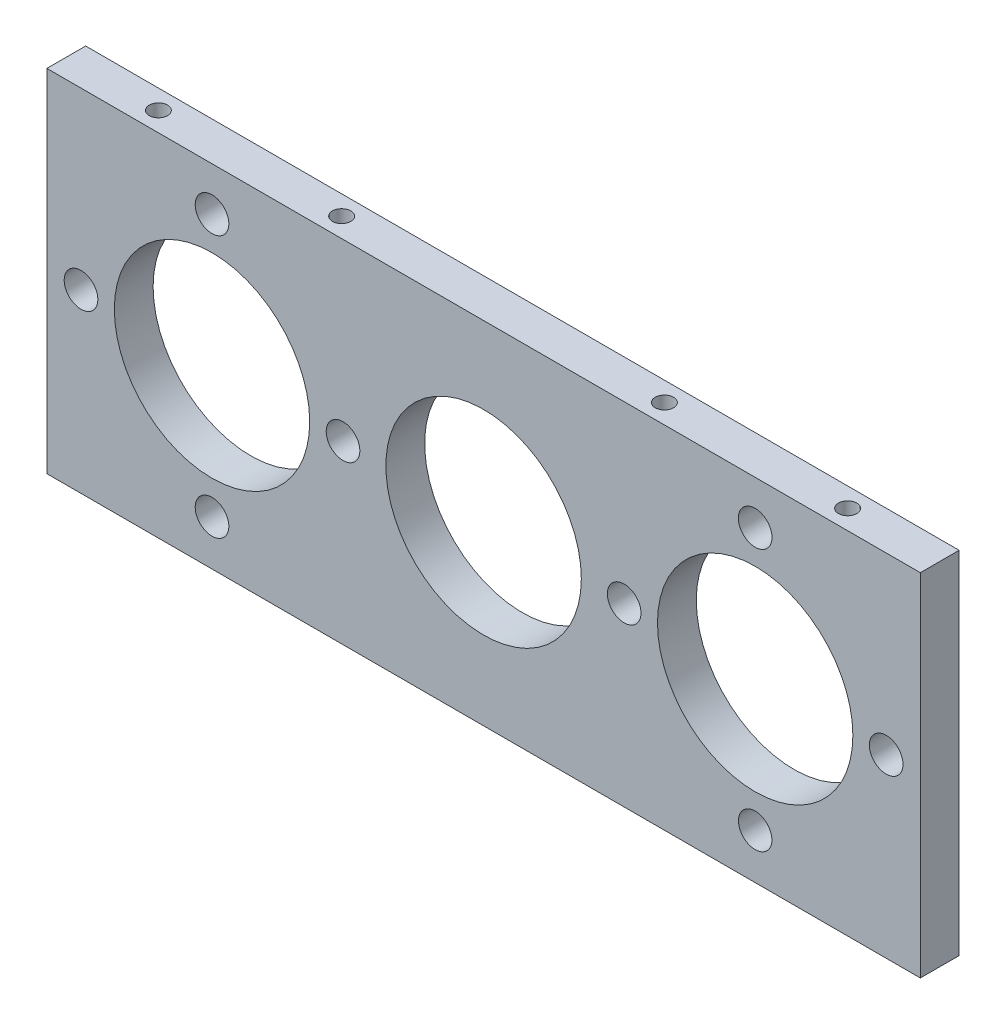
ISO-10303-21;
HEADER;
FILE_DESCRIPTION(('STEP AP214'),'2;1');
FILE_NAME('part.step','',(''),(''),'','','');
FILE_SCHEMA(('AUTOMOTIVE_DESIGN { 1 0 10303 214 1 1 1 1 }'));
ENDSEC;
DATA;
#1=APPLICATION_CONTEXT('core data for automotive mechanical design processes');
#2=APPLICATION_PROTOCOL_DEFINITION('international standard','automotive_design',2000,#1);
#3=PRODUCT_CONTEXT('',#1,'mechanical');
#4=PRODUCT('Part','Part','',(#3));
#5=PRODUCT_RELATED_PRODUCT_CATEGORY('part','',(#4));
#6=PRODUCT_DEFINITION_FORMATION('','',#4);
#7=PRODUCT_DEFINITION_CONTEXT('part definition',#1,'design');
#8=PRODUCT_DEFINITION('design','',#6,#7);
#9=PRODUCT_DEFINITION_SHAPE('','',#8);
#10=(LENGTH_UNIT() NAMED_UNIT(*) SI_UNIT(.MILLI.,.METRE.));
#11=(NAMED_UNIT(*) PLANE_ANGLE_UNIT() SI_UNIT($,.RADIAN.));
#12=(NAMED_UNIT(*) SI_UNIT($,.STERADIAN.) SOLID_ANGLE_UNIT());
#13=UNCERTAINTY_MEASURE_WITH_UNIT(LENGTH_MEASURE(1.E-05),#10,'distance_accuracy_value','');
#14=(GEOMETRIC_REPRESENTATION_CONTEXT(3) GLOBAL_UNCERTAINTY_ASSIGNED_CONTEXT((#13)) GLOBAL_UNIT_ASSIGNED_CONTEXT((#10,
#11,#12)) REPRESENTATION_CONTEXT('',''));
#15=CARTESIAN_POINT('',(0.,0.,0.));
#16=DIRECTION('',(0.,0.,1.));
#17=DIRECTION('',(1.,0.,0.));
#18=AXIS2_PLACEMENT_3D('',#15,#16,#17);
#19=CARTESIAN_POINT('',(-71.505,27.025,6.35));
#20=DIRECTION('',(1.,0.,0.));
#21=DIRECTION('',(0.,0.,-1.));
#22=AXIS2_PLACEMENT_3D('',#19,#20,#21);
#23=PLANE('',#22);
#24=DIRECTION('',(0.,-1.,0.));
#25=VECTOR('',#24,1.);
#26=CARTESIAN_POINT('',(-71.505,27.025,0.));
#27=LINE('',#26,#25);
#28=CARTESIAN_POINT('',(-71.505,30.445,0.));
#29=VERTEX_POINT('',#28);
#30=CARTESIAN_POINT('',(-71.505,-27.025,0.));
#31=VERTEX_POINT('',#30);
#32=EDGE_CURVE('E76',#29,#31,#27,.T.);
#33=ORIENTED_EDGE('',*,*,#32,.T.);
#34=DIRECTION('',(0.,0.,-1.));
#35=VECTOR('',#34,1.);
#36=CARTESIAN_POINT('',(-71.505,-27.025,6.35));
#37=LINE('',#36,#35);
#38=CARTESIAN_POINT('',(-71.505,-27.025,6.35));
#39=VERTEX_POINT('',#38);
#40=EDGE_CURVE('E11',#39,#31,#37,.T.);
#41=ORIENTED_EDGE('',*,*,#40,.F.);
#42=DIRECTION('',(0.,-1.,0.));
#43=VECTOR('',#42,1.);
#44=CARTESIAN_POINT('',(-71.505,27.025,6.35));
#45=LINE('',#44,#43);
#46=CARTESIAN_POINT('',(-71.505,30.445,6.35));
#47=VERTEX_POINT('',#46);
#48=EDGE_CURVE('E67',#47,#39,#45,.T.);
#49=ORIENTED_EDGE('',*,*,#48,.F.);
#50=DIRECTION('',(0.,0.,-1.));
#51=VECTOR('',#50,1.);
#52=CARTESIAN_POINT('',(-71.505,30.445,6.35));
#53=LINE('',#52,#51);
#54=EDGE_CURVE('E87',#47,#29,#53,.T.);
#55=ORIENTED_EDGE('',*,*,#54,.T.);
#56=EDGE_LOOP('',(#33,#41,#49,#55));
#57=FACE_BOUND('',#56,.T.);
#58=ADVANCED_FACE('F32',(#57),#23,.F.);
#59=CARTESIAN_POINT('',(-71.505,-27.025,6.35));
#60=DIRECTION('',(0.,1.,0.));
#61=DIRECTION('',(0.,0.,1.));
#62=AXIS2_PLACEMENT_3D('',#59,#60,#61);
#63=PLANE('',#62);
#64=DIRECTION('',(1.,0.,0.));
#65=VECTOR('',#64,1.);
#66=CARTESIAN_POINT('',(-71.505,-27.025,0.));
#67=LINE('',#66,#65);
#68=CARTESIAN_POINT('',(71.505,-27.025,0.));
#69=VERTEX_POINT('',#68);
#70=EDGE_CURVE('E60',#31,#69,#67,.T.);
#71=ORIENTED_EDGE('',*,*,#70,.T.);
#72=DIRECTION('',(0.,0.,-1.));
#73=VECTOR('',#72,1.);
#74=CARTESIAN_POINT('',(71.505,-27.025,6.35));
#75=LINE('',#74,#73);
#76=CARTESIAN_POINT('',(71.505,-27.025,6.35));
#77=VERTEX_POINT('',#76);
#78=EDGE_CURVE('E41',#77,#69,#75,.T.);
#79=ORIENTED_EDGE('',*,*,#78,.F.);
#80=DIRECTION('',(1.,0.,0.));
#81=VECTOR('',#80,1.);
#82=CARTESIAN_POINT('',(-71.505,-27.025,6.35));
#83=LINE('',#82,#81);
#84=EDGE_CURVE('E49',#39,#77,#83,.T.);
#85=ORIENTED_EDGE('',*,*,#84,.F.);
#86=ORIENTED_EDGE('',*,*,#40,.T.);
#87=EDGE_LOOP('',(#71,#79,#85,#86));
#88=FACE_BOUND('',#87,.T.);
#89=ADVANCED_FACE('F167',(#88),#63,.F.);
#90=CARTESIAN_POINT('',(71.505,27.025,6.35));
#91=DIRECTION('',(-1.,0.,0.));
#92=DIRECTION('',(0.,0.,1.));
#93=AXIS2_PLACEMENT_3D('',#90,#91,#92);
#94=PLANE('',#93);
#95=DIRECTION('',(0.,1.,0.));
#96=VECTOR('',#95,1.);
#97=CARTESIAN_POINT('',(71.505,27.025,0.));
#98=LINE('',#97,#96);
#99=CARTESIAN_POINT('',(71.505,30.445,0.));
#100=VERTEX_POINT('',#99);
#101=EDGE_CURVE('E156',#69,#100,#98,.T.);
#102=ORIENTED_EDGE('',*,*,#101,.T.);
#103=DIRECTION('',(0.,0.,-1.));
#104=VECTOR('',#103,1.);
#105=CARTESIAN_POINT('',(71.505,30.445,6.35));
#106=LINE('',#105,#104);
#107=CARTESIAN_POINT('',(71.505,30.445,6.35));
#108=VERTEX_POINT('',#107);
#109=EDGE_CURVE('E89',#108,#100,#106,.T.);
#110=ORIENTED_EDGE('',*,*,#109,.F.);
#111=DIRECTION('',(0.,1.,0.));
#112=VECTOR('',#111,1.);
#113=CARTESIAN_POINT('',(71.505,27.025,6.35));
#114=LINE('',#113,#112);
#115=EDGE_CURVE('E158',#77,#108,#114,.T.);
#116=ORIENTED_EDGE('',*,*,#115,.F.);
#117=ORIENTED_EDGE('',*,*,#78,.T.);
#118=EDGE_LOOP('',(#102,#110,#116,#117));
#119=FACE_BOUND('',#118,.T.);
#120=ADVANCED_FACE('F165',(#119),#94,.F.);
#121=CARTESIAN_POINT('',(-71.505,-27.025,6.35));
#122=DIRECTION('',(0.,0.,1.));
#123=DIRECTION('',(1.,0.,0.));
#124=AXIS2_PLACEMENT_3D('',#121,#122,#123);
#125=PLANE('',#124);
#126=CARTESIAN_POINT('',(-0.00186307186936935,1.8418504493771,6.35));
#127=DIRECTION('',(0.,0.,1.));
#128=DIRECTION('',(1.,0.,0.));
#129=AXIS2_PLACEMENT_3D('',#126,#127,#128);
#130=CIRCLE('',#129,16.);
#131=CARTESIAN_POINT('',(15.9981369281306,1.8418504493771,6.35));
#132=VERTEX_POINT('',#131);
#133=EDGE_CURVE('E507',#132,#132,#130,.T.);
#134=ORIENTED_EDGE('',*,*,#133,.F.);
#135=EDGE_LOOP('',(#134));
#136=FACE_BOUND('',#135,.T.);
#137=CARTESIAN_POINT('',(-44.4668630718694,1.84185044937741,6.35));
#138=DIRECTION('',(0.,0.,1.));
#139=DIRECTION('',(1.,0.,0.));
#140=AXIS2_PLACEMENT_3D('',#137,#138,#139);
#141=CIRCLE('',#140,15.995);
#142=CARTESIAN_POINT('',(-28.4718630718694,1.84185044937741,6.35));
#143=VERTEX_POINT('',#142);
#144=EDGE_CURVE('E99',#143,#143,#141,.T.);
#145=ORIENTED_EDGE('',*,*,#144,.F.);
#146=EDGE_LOOP('',(#145));
#147=FACE_BOUND('',#146,.T.);
#148=CARTESIAN_POINT('',(44.4631369281306,1.8418504493771,6.35));
#149=DIRECTION('',(0.,0.,1.));
#150=DIRECTION('',(1.,0.,0.));
#151=AXIS2_PLACEMENT_3D('',#148,#149,#150);
#152=CIRCLE('',#151,15.995);
#153=CARTESIAN_POINT('',(60.4581369281306,1.8418504493771,6.35));
#154=VERTEX_POINT('',#153);
#155=EDGE_CURVE('E105',#154,#154,#152,.T.);
#156=ORIENTED_EDGE('',*,*,#155,.F.);
#157=EDGE_LOOP('',(#156));
#158=FACE_BOUND('',#157,.T.);
#159=CARTESIAN_POINT('',(-44.4668630718693,23.2918504493774,6.35));
#160=DIRECTION('',(0.,0.,1.));
#161=DIRECTION('',(1.,0.,0.));
#162=AXIS2_PLACEMENT_3D('',#159,#160,#161);
#163=CIRCLE('',#162,2.755);
#164=CARTESIAN_POINT('',(-41.7118630718693,23.2918504493774,6.35));
#165=VERTEX_POINT('',#164);
#166=EDGE_CURVE('E111',#165,#165,#163,.F.);
#167=ORIENTED_EDGE('',*,*,#166,.T.);
#168=EDGE_LOOP('',(#167));
#169=FACE_BOUND('',#168,.T.);
#170=CARTESIAN_POINT('',(-65.9168630718694,1.84185044937741,6.35));
#171=DIRECTION('',(0.,0.,1.));
#172=DIRECTION('',(1.,0.,0.));
#173=AXIS2_PLACEMENT_3D('',#170,#171,#172);
#174=CIRCLE('',#173,2.75500000000001);
#175=CARTESIAN_POINT('',(-63.1618630718694,1.84185044937741,6.35));
#176=VERTEX_POINT('',#175);
#177=EDGE_CURVE('E117',#176,#176,#174,.F.);
#178=ORIENTED_EDGE('',*,*,#177,.T.);
#179=EDGE_LOOP('',(#178));
#180=FACE_BOUND('',#179,.T.);
#181=CARTESIAN_POINT('',(-44.4668630718696,-19.6081495506226,6.35));
#182=DIRECTION('',(0.,0.,1.));
#183=DIRECTION('',(1.,0.,0.));
#184=AXIS2_PLACEMENT_3D('',#181,#182,#183);
#185=CIRCLE('',#184,2.755);
#186=CARTESIAN_POINT('',(-41.7118630718696,-19.6081495506226,6.35));
#187=VERTEX_POINT('',#186);
#188=EDGE_CURVE('E123',#187,#187,#185,.F.);
#189=ORIENTED_EDGE('',*,*,#188,.T.);
#190=EDGE_LOOP('',(#189));
#191=FACE_BOUND('',#190,.T.);
#192=CARTESIAN_POINT('',(-23.0168630718694,1.84185044937726,6.35));
#193=DIRECTION('',(0.,0.,1.));
#194=DIRECTION('',(1.,0.,0.));
#195=AXIS2_PLACEMENT_3D('',#192,#193,#194);
#196=CIRCLE('',#195,2.755);
#197=CARTESIAN_POINT('',(-20.2618630718694,1.84185044937726,6.35));
#198=VERTEX_POINT('',#197);
#199=EDGE_CURVE('E129',#198,#198,#196,.F.);
#200=ORIENTED_EDGE('',*,*,#199,.T.);
#201=EDGE_LOOP('',(#200));
#202=FACE_BOUND('',#201,.T.);
#203=CARTESIAN_POINT('',(23.0131369281306,1.8418504493771,6.35));
#204=DIRECTION('',(0.,0.,1.));
#205=DIRECTION('',(1.,0.,0.));
#206=AXIS2_PLACEMENT_3D('',#203,#204,#205);
#207=CIRCLE('',#206,2.755);
#208=CARTESIAN_POINT('',(25.7681369281306,1.8418504493771,6.35));
#209=VERTEX_POINT('',#208);
#210=EDGE_CURVE('E135',#209,#209,#207,.F.);
#211=ORIENTED_EDGE('',*,*,#210,.T.);
#212=EDGE_LOOP('',(#211));
#213=FACE_BOUND('',#212,.T.);
#214=CARTESIAN_POINT('',(44.4631369281304,-19.6081495506229,6.35));
#215=DIRECTION('',(0.,0.,1.));
#216=DIRECTION('',(1.,0.,0.));
#217=AXIS2_PLACEMENT_3D('',#214,#215,#216);
#218=CIRCLE('',#217,2.73569173748039);
#219=CARTESIAN_POINT('',(47.1988286656108,-19.6081495506229,6.35));
#220=VERTEX_POINT('',#219);
#221=EDGE_CURVE('E141',#220,#220,#218,.F.);
#222=ORIENTED_EDGE('',*,*,#221,.T.);
#223=EDGE_LOOP('',(#222));
#224=FACE_BOUND('',#223,.T.);
#225=CARTESIAN_POINT('',(65.9131369281306,1.84185044937695,6.35));
#226=DIRECTION('',(0.,0.,1.));
#227=DIRECTION('',(1.,0.,0.));
#228=AXIS2_PLACEMENT_3D('',#225,#226,#227);
#229=CIRCLE('',#228,2.75556539322486);
#230=CARTESIAN_POINT('',(68.6687023213555,1.84185044937695,6.35));
#231=VERTEX_POINT('',#230);
#232=EDGE_CURVE('E147',#231,#231,#229,.F.);
#233=ORIENTED_EDGE('',*,*,#232,.T.);
#234=EDGE_LOOP('',(#233));
#235=FACE_BOUND('',#234,.T.);
#236=CARTESIAN_POINT('',(44.4631369281307,23.2918504493771,6.35));
#237=DIRECTION('',(0.,0.,1.));
#238=DIRECTION('',(1.,0.,0.));
#239=AXIS2_PLACEMENT_3D('',#236,#237,#238);
#240=CIRCLE('',#239,2.755);
#241=CARTESIAN_POINT('',(47.2181369281307,23.2918504493771,6.35));
#242=VERTEX_POINT('',#241);
#243=EDGE_CURVE('E80',#242,#242,#240,.F.);
#244=ORIENTED_EDGE('',*,*,#243,.T.);
#245=EDGE_LOOP('',(#244));
#246=FACE_BOUND('',#245,.T.);
#247=ORIENTED_EDGE('',*,*,#48,.T.);
#248=ORIENTED_EDGE('',*,*,#84,.T.);
#249=ORIENTED_EDGE('',*,*,#115,.T.);
#250=DIRECTION('',(-1.,0.,0.));
#251=VECTOR('',#250,1.);
#252=CARTESIAN_POINT('',(-71.505,30.445,6.35));
#253=LINE('',#252,#251);
#254=EDGE_CURVE('E90',#108,#47,#253,.T.);
#255=ORIENTED_EDGE('',*,*,#254,.T.);
#256=EDGE_LOOP('',(#247,#248,#249,#255));
#257=FACE_BOUND('',#256,.T.);
#258=ADVANCED_FACE('F168',(#136,#147,#158,#169,#180,#191,#202,#213,#224,#235,#246,#257),#125,.T.);
#259=CARTESIAN_POINT('',(-71.505,-27.025,0.));
#260=DIRECTION('',(0.,0.,1.));
#261=DIRECTION('',(1.,0.,0.));
#262=AXIS2_PLACEMENT_3D('',#259,#260,#261);
#263=PLANE('',#262);
#264=CARTESIAN_POINT('',(-0.00186307186936935,1.8418504493771,0.));
#265=DIRECTION('',(0.,0.,1.));
#266=DIRECTION('',(1.,0.,0.));
#267=AXIS2_PLACEMENT_3D('',#264,#265,#266);
#268=CIRCLE('',#267,16.);
#269=CARTESIAN_POINT('',(15.9981369281306,1.8418504493771,0.));
#270=VERTEX_POINT('',#269);
#271=EDGE_CURVE('E35',#270,#270,#268,.T.);
#272=ORIENTED_EDGE('',*,*,#271,.T.);
#273=EDGE_LOOP('',(#272));
#274=FACE_BOUND('',#273,.T.);
#275=CARTESIAN_POINT('',(-44.4668630718694,1.84185044937741,0.));
#276=DIRECTION('',(0.,0.,-1.));
#277=DIRECTION('',(-1.,0.,0.));
#278=AXIS2_PLACEMENT_3D('',#275,#276,#277);
#279=CIRCLE('',#278,15.995);
#280=CARTESIAN_POINT('',(-60.4618630718694,1.84185044937741,0.));
#281=VERTEX_POINT('',#280);
#282=EDGE_CURVE('E93',#281,#281,#279,.T.);
#283=ORIENTED_EDGE('',*,*,#282,.F.);
#284=EDGE_LOOP('',(#283));
#285=FACE_BOUND('',#284,.T.);
#286=CARTESIAN_POINT('',(44.4631369281306,1.8418504493771,0.));
#287=DIRECTION('',(0.,0.,-1.));
#288=DIRECTION('',(-1.,0.,0.));
#289=AXIS2_PLACEMENT_3D('',#286,#287,#288);
#290=CIRCLE('',#289,15.995);
#291=CARTESIAN_POINT('',(28.4681369281306,1.8418504493771,0.));
#292=VERTEX_POINT('',#291);
#293=EDGE_CURVE('E102',#292,#292,#290,.T.);
#294=ORIENTED_EDGE('',*,*,#293,.F.);
#295=EDGE_LOOP('',(#294));
#296=FACE_BOUND('',#295,.T.);
#297=CARTESIAN_POINT('',(-44.4668630718693,23.2918504493774,0.));
#298=DIRECTION('',(0.,0.,-1.));
#299=DIRECTION('',(-1.,0.,0.));
#300=AXIS2_PLACEMENT_3D('',#297,#298,#299);
#301=CIRCLE('',#300,2.755);
#302=CARTESIAN_POINT('',(-47.2218630718693,23.2918504493774,0.));
#303=VERTEX_POINT('',#302);
#304=EDGE_CURVE('E108',#303,#303,#301,.T.);
#305=ORIENTED_EDGE('',*,*,#304,.F.);
#306=EDGE_LOOP('',(#305));
#307=FACE_BOUND('',#306,.T.);
#308=CARTESIAN_POINT('',(-65.9168630718694,1.84185044937741,0.));
#309=DIRECTION('',(0.,0.,-1.));
#310=DIRECTION('',(-1.,0.,0.));
#311=AXIS2_PLACEMENT_3D('',#308,#309,#310);
#312=CIRCLE('',#311,2.75500000000001);
#313=CARTESIAN_POINT('',(-68.6718630718694,1.84185044937741,0.));
#314=VERTEX_POINT('',#313);
#315=EDGE_CURVE('E114',#314,#314,#312,.T.);
#316=ORIENTED_EDGE('',*,*,#315,.F.);
#317=EDGE_LOOP('',(#316));
#318=FACE_BOUND('',#317,.T.);
#319=CARTESIAN_POINT('',(-44.4668630718696,-19.6081495506226,0.));
#320=DIRECTION('',(0.,0.,-1.));
#321=DIRECTION('',(-1.,0.,0.));
#322=AXIS2_PLACEMENT_3D('',#319,#320,#321);
#323=CIRCLE('',#322,2.755);
#324=CARTESIAN_POINT('',(-47.2218630718696,-19.6081495506226,0.));
#325=VERTEX_POINT('',#324);
#326=EDGE_CURVE('E120',#325,#325,#323,.T.);
#327=ORIENTED_EDGE('',*,*,#326,.F.);
#328=EDGE_LOOP('',(#327));
#329=FACE_BOUND('',#328,.T.);
#330=CARTESIAN_POINT('',(-23.0168630718694,1.84185044937726,0.));
#331=DIRECTION('',(0.,0.,-1.));
#332=DIRECTION('',(-1.,0.,0.));
#333=AXIS2_PLACEMENT_3D('',#330,#331,#332);
#334=CIRCLE('',#333,2.755);
#335=CARTESIAN_POINT('',(-25.7718630718694,1.84185044937726,0.));
#336=VERTEX_POINT('',#335);
#337=EDGE_CURVE('E126',#336,#336,#334,.T.);
#338=ORIENTED_EDGE('',*,*,#337,.F.);
#339=EDGE_LOOP('',(#338));
#340=FACE_BOUND('',#339,.T.);
#341=CARTESIAN_POINT('',(23.0131369281306,1.8418504493771,0.));
#342=DIRECTION('',(0.,0.,-1.));
#343=DIRECTION('',(-1.,0.,0.));
#344=AXIS2_PLACEMENT_3D('',#341,#342,#343);
#345=CIRCLE('',#344,2.755);
#346=CARTESIAN_POINT('',(20.2581369281306,1.8418504493771,0.));
#347=VERTEX_POINT('',#346);
#348=EDGE_CURVE('E132',#347,#347,#345,.T.);
#349=ORIENTED_EDGE('',*,*,#348,.F.);
#350=EDGE_LOOP('',(#349));
#351=FACE_BOUND('',#350,.T.);
#352=CARTESIAN_POINT('',(44.4631369281304,-19.6081495506229,0.));
#353=DIRECTION('',(0.,0.,-1.));
#354=DIRECTION('',(-1.,0.,0.));
#355=AXIS2_PLACEMENT_3D('',#352,#353,#354);
#356=CIRCLE('',#355,2.73569173748039);
#357=CARTESIAN_POINT('',(41.72744519065,-19.6081495506229,0.));
#358=VERTEX_POINT('',#357);
#359=EDGE_CURVE('E138',#358,#358,#356,.T.);
#360=ORIENTED_EDGE('',*,*,#359,.F.);
#361=EDGE_LOOP('',(#360));
#362=FACE_BOUND('',#361,.T.);
#363=CARTESIAN_POINT('',(65.9131369281306,1.84185044937695,0.));
#364=DIRECTION('',(0.,0.,-1.));
#365=DIRECTION('',(-1.,0.,0.));
#366=AXIS2_PLACEMENT_3D('',#363,#364,#365);
#367=CIRCLE('',#366,2.75556539322486);
#368=CARTESIAN_POINT('',(63.1575715349058,1.84185044937695,0.));
#369=VERTEX_POINT('',#368);
#370=EDGE_CURVE('E144',#369,#369,#367,.T.);
#371=ORIENTED_EDGE('',*,*,#370,.F.);
#372=EDGE_LOOP('',(#371));
#373=FACE_BOUND('',#372,.T.);
#374=CARTESIAN_POINT('',(44.4631369281307,23.2918504493771,0.));
#375=DIRECTION('',(0.,0.,-1.));
#376=DIRECTION('',(-1.,0.,0.));
#377=AXIS2_PLACEMENT_3D('',#374,#375,#376);
#378=CIRCLE('',#377,2.755);
#379=CARTESIAN_POINT('',(41.7081369281307,23.2918504493771,0.));
#380=VERTEX_POINT('',#379);
#381=EDGE_CURVE('E150',#380,#380,#378,.T.);
#382=ORIENTED_EDGE('',*,*,#381,.F.);
#383=EDGE_LOOP('',(#382));
#384=FACE_BOUND('',#383,.T.);
#385=ORIENTED_EDGE('',*,*,#32,.F.);
#386=DIRECTION('',(-1.,0.,0.));
#387=VECTOR('',#386,1.);
#388=CARTESIAN_POINT('',(-71.505,30.445,0.));
#389=LINE('',#388,#387);
#390=EDGE_CURVE('E79',#100,#29,#389,.T.);
#391=ORIENTED_EDGE('',*,*,#390,.F.);
#392=ORIENTED_EDGE('',*,*,#101,.F.);
#393=ORIENTED_EDGE('',*,*,#70,.F.);
#394=EDGE_LOOP('',(#385,#391,#392,#393));
#395=FACE_BOUND('',#394,.T.);
#396=ADVANCED_FACE('F78',(#274,#285,#296,#307,#318,#329,#340,#351,#362,#373,#384,#395),#263,.F.);
#397=CARTESIAN_POINT('',(44.4631369281307,23.2918504493771,14.1439159022091));
#398=DIRECTION('',(0.,0.,-1.));
#399=DIRECTION('',(-1.,0.,0.));
#400=AXIS2_PLACEMENT_3D('',#397,#398,#399);
#401=CYLINDRICAL_SURFACE('',#400,2.755);
#402=ORIENTED_EDGE('',*,*,#381,.T.);
#403=EDGE_LOOP('',(#402));
#404=FACE_BOUND('',#403,.T.);
#405=ORIENTED_EDGE('',*,*,#243,.F.);
#406=EDGE_LOOP('',(#405));
#407=FACE_BOUND('',#406,.T.);
#408=ADVANCED_FACE('F176',(#404,#407),#401,.F.);
#409=CARTESIAN_POINT('',(65.9131369281306,1.84185044937695,14.1439159022091));
#410=DIRECTION('',(0.,0.,-1.));
#411=DIRECTION('',(-1.,0.,0.));
#412=AXIS2_PLACEMENT_3D('',#409,#410,#411);
#413=CYLINDRICAL_SURFACE('',#412,2.75556539322486);
#414=ORIENTED_EDGE('',*,*,#370,.T.);
#415=EDGE_LOOP('',(#414));
#416=FACE_BOUND('',#415,.T.);
#417=ORIENTED_EDGE('',*,*,#232,.F.);
#418=EDGE_LOOP('',(#417));
#419=FACE_BOUND('',#418,.T.);
#420=ADVANCED_FACE('F402',(#416,#419),#413,.F.);
#421=CARTESIAN_POINT('',(44.4631369281304,-19.6081495506229,14.1439159022091));
#422=DIRECTION('',(0.,0.,-1.));
#423=DIRECTION('',(-1.,0.,0.));
#424=AXIS2_PLACEMENT_3D('',#421,#422,#423);
#425=CYLINDRICAL_SURFACE('',#424,2.73569173748039);
#426=ORIENTED_EDGE('',*,*,#359,.T.);
#427=EDGE_LOOP('',(#426));
#428=FACE_BOUND('',#427,.T.);
#429=ORIENTED_EDGE('',*,*,#221,.F.);
#430=EDGE_LOOP('',(#429));
#431=FACE_BOUND('',#430,.T.);
#432=ADVANCED_FACE('F393',(#428,#431),#425,.F.);
#433=CARTESIAN_POINT('',(23.0131369281306,1.8418504493771,14.1439159022091));
#434=DIRECTION('',(0.,0.,-1.));
#435=DIRECTION('',(-1.,0.,0.));
#436=AXIS2_PLACEMENT_3D('',#433,#434,#435);
#437=CYLINDRICAL_SURFACE('',#436,2.755);
#438=ORIENTED_EDGE('',*,*,#348,.T.);
#439=EDGE_LOOP('',(#438));
#440=FACE_BOUND('',#439,.T.);
#441=ORIENTED_EDGE('',*,*,#210,.F.);
#442=EDGE_LOOP('',(#441));
#443=FACE_BOUND('',#442,.T.);
#444=ADVANCED_FACE('F384',(#440,#443),#437,.F.);
#445=CARTESIAN_POINT('',(-23.0168630718694,1.84185044937726,14.1439159022091));
#446=DIRECTION('',(0.,0.,-1.));
#447=DIRECTION('',(-1.,0.,0.));
#448=AXIS2_PLACEMENT_3D('',#445,#446,#447);
#449=CYLINDRICAL_SURFACE('',#448,2.755);
#450=ORIENTED_EDGE('',*,*,#337,.T.);
#451=EDGE_LOOP('',(#450));
#452=FACE_BOUND('',#451,.T.);
#453=ORIENTED_EDGE('',*,*,#199,.F.);
#454=EDGE_LOOP('',(#453));
#455=FACE_BOUND('',#454,.T.);
#456=ADVANCED_FACE('F375',(#452,#455),#449,.F.);
#457=CARTESIAN_POINT('',(-44.4668630718696,-19.6081495506226,14.1439159022091));
#458=DIRECTION('',(0.,0.,-1.));
#459=DIRECTION('',(-1.,0.,0.));
#460=AXIS2_PLACEMENT_3D('',#457,#458,#459);
#461=CYLINDRICAL_SURFACE('',#460,2.755);
#462=ORIENTED_EDGE('',*,*,#326,.T.);
#463=EDGE_LOOP('',(#462));
#464=FACE_BOUND('',#463,.T.);
#465=ORIENTED_EDGE('',*,*,#188,.F.);
#466=EDGE_LOOP('',(#465));
#467=FACE_BOUND('',#466,.T.);
#468=ADVANCED_FACE('F366',(#464,#467),#461,.F.);
#469=CARTESIAN_POINT('',(-65.9168630718694,1.84185044937741,14.1439159022091));
#470=DIRECTION('',(0.,0.,-1.));
#471=DIRECTION('',(-1.,0.,0.));
#472=AXIS2_PLACEMENT_3D('',#469,#470,#471);
#473=CYLINDRICAL_SURFACE('',#472,2.75500000000001);
#474=ORIENTED_EDGE('',*,*,#315,.T.);
#475=EDGE_LOOP('',(#474));
#476=FACE_BOUND('',#475,.T.);
#477=ORIENTED_EDGE('',*,*,#177,.F.);
#478=EDGE_LOOP('',(#477));
#479=FACE_BOUND('',#478,.T.);
#480=ADVANCED_FACE('F357',(#476,#479),#473,.F.);
#481=CARTESIAN_POINT('',(-44.4668630718693,23.2918504493774,14.1439159022091));
#482=DIRECTION('',(0.,0.,-1.));
#483=DIRECTION('',(-1.,0.,0.));
#484=AXIS2_PLACEMENT_3D('',#481,#482,#483);
#485=CYLINDRICAL_SURFACE('',#484,2.755);
#486=ORIENTED_EDGE('',*,*,#304,.T.);
#487=EDGE_LOOP('',(#486));
#488=FACE_BOUND('',#487,.T.);
#489=ORIENTED_EDGE('',*,*,#166,.F.);
#490=EDGE_LOOP('',(#489));
#491=FACE_BOUND('',#490,.T.);
#492=ADVANCED_FACE('F348',(#488,#491),#485,.F.);
#493=CARTESIAN_POINT('',(44.4631369281306,1.8418504493771,10.));
#494=DIRECTION('',(0.,0.,-1.));
#495=DIRECTION('',(-1.,0.,0.));
#496=AXIS2_PLACEMENT_3D('',#493,#494,#495);
#497=CYLINDRICAL_SURFACE('',#496,15.995);
#498=ORIENTED_EDGE('',*,*,#155,.T.);
#499=EDGE_LOOP('',(#498));
#500=FACE_BOUND('',#499,.T.);
#501=ORIENTED_EDGE('',*,*,#293,.T.);
#502=EDGE_LOOP('',(#501));
#503=FACE_BOUND('',#502,.T.);
#504=ADVANCED_FACE('F340',(#500,#503),#497,.F.);
#505=CARTESIAN_POINT('',(-44.4668630718694,1.84185044937741,10.));
#506=DIRECTION('',(0.,0.,-1.));
#507=DIRECTION('',(-1.,0.,0.));
#508=AXIS2_PLACEMENT_3D('',#505,#506,#507);
#509=CYLINDRICAL_SURFACE('',#508,15.995);
#510=ORIENTED_EDGE('',*,*,#144,.T.);
#511=EDGE_LOOP('',(#510));
#512=FACE_BOUND('',#511,.T.);
#513=ORIENTED_EDGE('',*,*,#282,.T.);
#514=EDGE_LOOP('',(#513));
#515=FACE_BOUND('',#514,.T.);
#516=ADVANCED_FACE('F212',(#512,#515),#509,.F.);
#517=CARTESIAN_POINT('',(-71.505,30.445,6.35));
#518=DIRECTION('',(0.,-1.,0.));
#519=DIRECTION('',(0.,0.,-1.));
#520=AXIS2_PLACEMENT_3D('',#517,#518,#519);
#521=PLANE('',#520);
#522=CARTESIAN_POINT('',(-56.423186497269,30.445,3.175));
#523=DIRECTION('',(0.,1.,0.));
#524=DIRECTION('',(0.,0.,-1.));
#525=AXIS2_PLACEMENT_3D('',#522,#523,#524);
#526=CIRCLE('',#525,1.5);
#527=CARTESIAN_POINT('',(-56.423186497269,30.445,1.67499999999999));
#528=VERTEX_POINT('',#527);
#529=EDGE_CURVE('E487',#528,#528,#526,.T.);
#530=ORIENTED_EDGE('',*,*,#529,.F.);
#531=EDGE_LOOP('',(#530));
#532=FACE_BOUND('',#531,.T.);
#533=CARTESIAN_POINT('',(-26.423186497269,30.445,3.17499999999999));
#534=DIRECTION('',(0.,1.,0.));
#535=DIRECTION('',(0.,0.,-1.));
#536=AXIS2_PLACEMENT_3D('',#533,#534,#535);
#537=CIRCLE('',#536,1.5);
#538=CARTESIAN_POINT('',(-26.423186497269,30.445,1.67499999999999));
#539=VERTEX_POINT('',#538);
#540=EDGE_CURVE('E486',#539,#539,#537,.T.);
#541=ORIENTED_EDGE('',*,*,#540,.F.);
#542=EDGE_LOOP('',(#541));
#543=FACE_BOUND('',#542,.T.);
#544=CARTESIAN_POINT('',(26.423186497269,30.445,3.17499999999999));
#545=DIRECTION('',(0.,1.,0.));
#546=DIRECTION('',(0.,0.,1.));
#547=AXIS2_PLACEMENT_3D('',#544,#545,#546);
#548=CIRCLE('',#547,1.5);
#549=CARTESIAN_POINT('',(26.423186497269,30.445,4.67499999999999));
#550=VERTEX_POINT('',#549);
#551=EDGE_CURVE('E496',#550,#550,#548,.T.);
#552=ORIENTED_EDGE('',*,*,#551,.F.);
#553=EDGE_LOOP('',(#552));
#554=FACE_BOUND('',#553,.T.);
#555=CARTESIAN_POINT('',(56.423186497269,30.445,3.17499999999998));
#556=DIRECTION('',(0.,1.,0.));
#557=DIRECTION('',(0.,0.,1.));
#558=AXIS2_PLACEMENT_3D('',#555,#556,#557);
#559=CIRCLE('',#558,1.5);
#560=CARTESIAN_POINT('',(56.423186497269,30.445,4.67499999999999));
#561=VERTEX_POINT('',#560);
#562=EDGE_CURVE('E501',#561,#561,#559,.T.);
#563=ORIENTED_EDGE('',*,*,#562,.F.);
#564=EDGE_LOOP('',(#563));
#565=FACE_BOUND('',#564,.T.);
#566=ORIENTED_EDGE('',*,*,#390,.T.);
#567=ORIENTED_EDGE('',*,*,#54,.F.);
#568=ORIENTED_EDGE('',*,*,#254,.F.);
#569=ORIENTED_EDGE('',*,*,#109,.T.);
#570=EDGE_LOOP('',(#566,#567,#568,#569));
#571=FACE_BOUND('',#570,.T.);
#572=ADVANCED_FACE('F85',(#532,#543,#554,#565,#571),#521,.F.);
#573=CARTESIAN_POINT('',(-0.00186307186936935,1.8418504493771,-3.65));
#574=DIRECTION('',(0.,0.,1.));
#575=DIRECTION('',(1.,0.,0.));
#576=AXIS2_PLACEMENT_3D('',#573,#574,#575);
#577=CYLINDRICAL_SURFACE('',#576,16.);
#578=ORIENTED_EDGE('',*,*,#133,.T.);
#579=EDGE_LOOP('',(#578));
#580=FACE_BOUND('',#579,.T.);
#581=ORIENTED_EDGE('',*,*,#271,.F.);
#582=EDGE_LOOP('',(#581));
#583=FACE_BOUND('',#582,.T.);
#584=ADVANCED_FACE('F211',(#580,#583),#577,.F.);
#585=CARTESIAN_POINT('',(56.423186497269,15.445,3.17499999999998));
#586=DIRECTION('',(0.,1.,0.));
#587=DIRECTION('',(0.,0.,1.));
#588=AXIS2_PLACEMENT_3D('',#585,#586,#587);
#589=CYLINDRICAL_SURFACE('',#588,1.5);
#590=CARTESIAN_POINT('',(56.423186497269,15.445,3.17499999999998));
#591=DIRECTION('',(0.,1.,0.));
#592=DIRECTION('',(0.,0.,1.));
#593=AXIS2_PLACEMENT_3D('',#590,#591,#592);
#594=CIRCLE('',#593,1.5);
#595=CARTESIAN_POINT('',(56.423186497269,15.445,4.67499999999999));
#596=VERTEX_POINT('',#595);
#597=EDGE_CURVE('E504',#596,#596,#594,.T.);
#598=ORIENTED_EDGE('',*,*,#597,.F.);
#599=EDGE_LOOP('',(#598));
#600=FACE_BOUND('',#599,.T.);
#601=ORIENTED_EDGE('',*,*,#562,.T.);
#602=EDGE_LOOP('',(#601));
#603=FACE_BOUND('',#602,.T.);
#604=ADVANCED_FACE('F226',(#600,#603),#589,.F.);
#605=CARTESIAN_POINT('',(56.423186497269,15.445,3.17499999999998));
#606=DIRECTION('',(0.,1.,0.));
#607=DIRECTION('',(0.,0.,1.));
#608=AXIS2_PLACEMENT_3D('',#605,#606,#607);
#609=PLANE('',#608);
#610=ORIENTED_EDGE('',*,*,#597,.T.);
#611=EDGE_LOOP('',(#610));
#612=FACE_BOUND('',#611,.T.);
#613=ADVANCED_FACE('F233',(#612),#609,.T.);
#614=CARTESIAN_POINT('',(26.423186497269,15.445,3.17499999999999));
#615=DIRECTION('',(0.,1.,0.));
#616=DIRECTION('',(0.,0.,1.));
#617=AXIS2_PLACEMENT_3D('',#614,#615,#616);
#618=CYLINDRICAL_SURFACE('',#617,1.5);
#619=CARTESIAN_POINT('',(26.423186497269,15.445,3.17499999999999));
#620=DIRECTION('',(0.,1.,0.));
#621=DIRECTION('',(0.,0.,1.));
#622=AXIS2_PLACEMENT_3D('',#619,#620,#621);
#623=CIRCLE('',#622,1.5);
#624=CARTESIAN_POINT('',(26.423186497269,15.445,4.67499999999999));
#625=VERTEX_POINT('',#624);
#626=EDGE_CURVE('E498',#625,#625,#623,.T.);
#627=ORIENTED_EDGE('',*,*,#626,.F.);
#628=EDGE_LOOP('',(#627));
#629=FACE_BOUND('',#628,.T.);
#630=ORIENTED_EDGE('',*,*,#551,.T.);
#631=EDGE_LOOP('',(#630));
#632=FACE_BOUND('',#631,.T.);
#633=ADVANCED_FACE('F241',(#629,#632),#618,.F.);
#634=CARTESIAN_POINT('',(26.423186497269,15.445,3.17499999999999));
#635=DIRECTION('',(0.,1.,0.));
#636=DIRECTION('',(0.,0.,1.));
#637=AXIS2_PLACEMENT_3D('',#634,#635,#636);
#638=PLANE('',#637);
#639=ORIENTED_EDGE('',*,*,#626,.T.);
#640=EDGE_LOOP('',(#639));
#641=FACE_BOUND('',#640,.T.);
#642=ADVANCED_FACE('F249',(#641),#638,.T.);
#643=CARTESIAN_POINT('',(-26.423186497269,15.445,3.17499999999999));
#644=DIRECTION('',(0.,1.,0.));
#645=DIRECTION('',(0.,0.,1.));
#646=AXIS2_PLACEMENT_3D('',#643,#644,#645);
#647=CYLINDRICAL_SURFACE('',#646,1.5);
#648=CARTESIAN_POINT('',(-26.423186497269,15.445,3.17499999999999));
#649=DIRECTION('',(0.,1.,0.));
#650=DIRECTION('',(0.,0.,-1.));
#651=AXIS2_PLACEMENT_3D('',#648,#649,#650);
#652=CIRCLE('',#651,1.5);
#653=CARTESIAN_POINT('',(-26.423186497269,15.445,1.67499999999999));
#654=VERTEX_POINT('',#653);
#655=EDGE_CURVE('E490',#654,#654,#652,.T.);
#656=ORIENTED_EDGE('',*,*,#655,.F.);
#657=EDGE_LOOP('',(#656));
#658=FACE_BOUND('',#657,.T.);
#659=ORIENTED_EDGE('',*,*,#540,.T.);
#660=EDGE_LOOP('',(#659));
#661=FACE_BOUND('',#660,.T.);
#662=ADVANCED_FACE('F257',(#658,#661),#647,.F.);
#663=CARTESIAN_POINT('',(-26.423186497269,15.445,3.17499999999999));
#664=DIRECTION('',(0.,-1.,0.));
#665=DIRECTION('',(0.,0.,-1.));
#666=AXIS2_PLACEMENT_3D('',#663,#664,#665);
#667=PLANE('',#666);
#668=ORIENTED_EDGE('',*,*,#655,.T.);
#669=EDGE_LOOP('',(#668));
#670=FACE_BOUND('',#669,.T.);
#671=ADVANCED_FACE('F265',(#670),#667,.F.);
#672=CARTESIAN_POINT('',(-56.423186497269,15.445,3.175));
#673=DIRECTION('',(0.,1.,0.));
#674=DIRECTION('',(0.,0.,1.));
#675=AXIS2_PLACEMENT_3D('',#672,#673,#674);
#676=CYLINDRICAL_SURFACE('',#675,1.5);
#677=CARTESIAN_POINT('',(-56.423186497269,15.445,3.175));
#678=DIRECTION('',(0.,1.,0.));
#679=DIRECTION('',(0.,0.,-1.));
#680=AXIS2_PLACEMENT_3D('',#677,#678,#679);
#681=CIRCLE('',#680,1.5);
#682=CARTESIAN_POINT('',(-56.423186497269,15.445,1.67499999999999));
#683=VERTEX_POINT('',#682);
#684=EDGE_CURVE('E485',#683,#683,#681,.T.);
#685=ORIENTED_EDGE('',*,*,#684,.F.);
#686=EDGE_LOOP('',(#685));
#687=FACE_BOUND('',#686,.T.);
#688=ORIENTED_EDGE('',*,*,#529,.T.);
#689=EDGE_LOOP('',(#688));
#690=FACE_BOUND('',#689,.T.);
#691=ADVANCED_FACE('F273',(#687,#690),#676,.F.);
#692=CARTESIAN_POINT('',(-56.423186497269,15.445,3.175));
#693=DIRECTION('',(0.,-1.,0.));
#694=DIRECTION('',(0.,0.,-1.));
#695=AXIS2_PLACEMENT_3D('',#692,#693,#694);
#696=PLANE('',#695);
#697=ORIENTED_EDGE('',*,*,#684,.T.);
#698=EDGE_LOOP('',(#697));
#699=FACE_BOUND('',#698,.T.);
#700=ADVANCED_FACE('F281',(#699),#696,.F.);
#701=CLOSED_SHELL('',(#58,#89,#120,#258,#396,#408,#420,#432,#444,#456,#468,#480,#492,#504,#516,
#572,#584,#604,#613,#633,#642,#662,#671,#691,#700));
#702=MANIFOLD_SOLID_BREP('B2',#701);
#703=ADVANCED_BREP_SHAPE_REPRESENTATION('',(#18,#702),#14);
#704=SHAPE_DEFINITION_REPRESENTATION(#9,#703);
ENDSEC;
END-ISO-10303-21;
